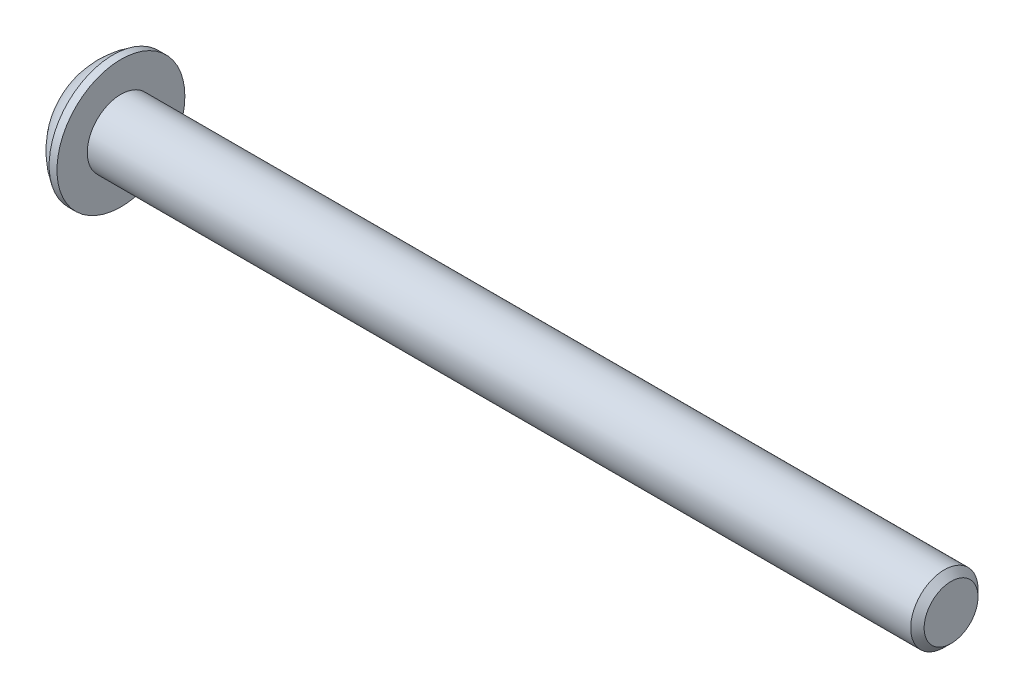
ISO-10303-21;
HEADER;
FILE_DESCRIPTION(('STEP AP214'),'2;1');
FILE_NAME('part.step','',(''),(''),'','','');
FILE_SCHEMA(('AUTOMOTIVE_DESIGN { 1 0 10303 214 1 1 1 1 }'));
ENDSEC;
DATA;
#1=APPLICATION_CONTEXT('core data for automotive mechanical design processes');
#2=APPLICATION_PROTOCOL_DEFINITION('international standard','automotive_design',2000,#1);
#3=PRODUCT_CONTEXT('',#1,'mechanical');
#4=PRODUCT('Part','Part','',(#3));
#5=PRODUCT_RELATED_PRODUCT_CATEGORY('part','',(#4));
#6=PRODUCT_DEFINITION_FORMATION('','',#4);
#7=PRODUCT_DEFINITION_CONTEXT('part definition',#1,'design');
#8=PRODUCT_DEFINITION('design','',#6,#7);
#9=PRODUCT_DEFINITION_SHAPE('','',#8);
#10=(LENGTH_UNIT() NAMED_UNIT(*) SI_UNIT(.MILLI.,.METRE.));
#11=(NAMED_UNIT(*) PLANE_ANGLE_UNIT() SI_UNIT($,.RADIAN.));
#12=(NAMED_UNIT(*) SI_UNIT($,.STERADIAN.) SOLID_ANGLE_UNIT());
#13=UNCERTAINTY_MEASURE_WITH_UNIT(LENGTH_MEASURE(1.E-05),#10,'distance_accuracy_value','');
#14=(GEOMETRIC_REPRESENTATION_CONTEXT(3) GLOBAL_UNCERTAINTY_ASSIGNED_CONTEXT((#13)) GLOBAL_UNIT_ASSIGNED_CONTEXT((#10,
#11,#12)) REPRESENTATION_CONTEXT('',''));
#15=CARTESIAN_POINT('',(0.,0.,0.));
#16=DIRECTION('',(0.,0.,1.));
#17=DIRECTION('',(1.,0.,0.));
#18=AXIS2_PLACEMENT_3D('',#15,#16,#17);
#19=CARTESIAN_POINT('',(-18.5,2.85,0.));
#20=DIRECTION('',(1.,0.,0.));
#21=DIRECTION('',(0.,0.,-1.));
#22=AXIS2_PLACEMENT_3D('',#19,#20,#21);
#23=PLANE('',#22);
#24=CARTESIAN_POINT('',(-18.5,0.,0.));
#25=DIRECTION('',(1.,0.,0.));
#26=DIRECTION('',(0.,0.,-1.));
#27=AXIS2_PLACEMENT_3D('',#24,#25,#26);
#28=CIRCLE('',#27,2.85);
#29=CARTESIAN_POINT('',(-18.5,0.,-2.85));
#30=VERTEX_POINT('',#29);
#31=EDGE_CURVE('E161',#30,#30,#28,.T.);
#32=ORIENTED_EDGE('',*,*,#31,.T.);
#33=EDGE_LOOP('',(#32));
#34=FACE_BOUND('',#33,.T.);
#35=CARTESIAN_POINT('',(-18.5,0.,0.));
#36=DIRECTION('',(1.,0.,0.));
#37=DIRECTION('',(0.,0.,-1.));
#38=AXIS2_PLACEMENT_3D('',#35,#36,#37);
#39=CIRCLE('',#38,1.5);
#40=CARTESIAN_POINT('',(-18.5,0.,-1.5));
#41=VERTEX_POINT('',#40);
#42=EDGE_CURVE('E182',#41,#41,#39,.T.);
#43=ORIENTED_EDGE('',*,*,#42,.F.);
#44=EDGE_LOOP('',(#43));
#45=FACE_BOUND('',#44,.T.);
#46=ADVANCED_FACE('F45',(#34,#45),#23,.T.);
#47=CARTESIAN_POINT('',(18.5,0.,0.));
#48=DIRECTION('',(1.,0.,0.));
#49=DIRECTION('',(0.,0.,-1.));
#50=AXIS2_PLACEMENT_3D('',#47,#48,#49);
#51=CYLINDRICAL_SURFACE('',#50,1.5);
#52=CARTESIAN_POINT('',(18.2,0.,0.));
#53=DIRECTION('',(1.,0.,0.));
#54=DIRECTION('',(0.,0.,-1.));
#55=AXIS2_PLACEMENT_3D('',#52,#53,#54);
#56=CIRCLE('',#55,1.5);
#57=CARTESIAN_POINT('',(18.2,0.,-1.5));
#58=VERTEX_POINT('',#57);
#59=EDGE_CURVE('E11',#58,#58,#56,.F.);
#60=ORIENTED_EDGE('',*,*,#59,.T.);
#61=EDGE_LOOP('',(#60));
#62=FACE_BOUND('',#61,.T.);
#63=ORIENTED_EDGE('',*,*,#42,.T.);
#64=EDGE_LOOP('',(#63));
#65=FACE_BOUND('',#64,.T.);
#66=ADVANCED_FACE('F206',(#62,#65),#51,.T.);
#67=CARTESIAN_POINT('',(18.5,0.,0.));
#68=DIRECTION('',(1.,0.,0.));
#69=DIRECTION('',(0.,0.,-1.));
#70=AXIS2_PLACEMENT_3D('',#67,#68,#69);
#71=PLANE('',#70);
#72=CARTESIAN_POINT('',(18.5,0.,0.));
#73=DIRECTION('',(1.,0.,0.));
#74=DIRECTION('',(0.,0.,-1.));
#75=AXIS2_PLACEMENT_3D('',#72,#73,#74);
#76=CIRCLE('',#75,1.2);
#77=CARTESIAN_POINT('',(18.5,0.,-1.2));
#78=VERTEX_POINT('',#77);
#79=EDGE_CURVE('E55',#78,#78,#76,.T.);
#80=ORIENTED_EDGE('',*,*,#79,.T.);
#81=EDGE_LOOP('',(#80));
#82=FACE_BOUND('',#81,.T.);
#83=ADVANCED_FACE('F189',(#82),#71,.T.);
#84=CARTESIAN_POINT('',(-20.15,0.,0.));
#85=DIRECTION('',(-1.,0.,0.));
#86=DIRECTION('',(0.,0.,1.));
#87=AXIS2_PLACEMENT_3D('',#84,#85,#86);
#88=PLANE('',#87);
#89=DIRECTION('',(0.,-0.5,-0.866025403784438));
#90=VECTOR('',#89,1.);
#91=CARTESIAN_POINT('',(-20.15,1.15470053837925,0.));
#92=LINE('',#91,#90);
#93=CARTESIAN_POINT('',(-20.15,1.15470053837925,0.));
#94=VERTEX_POINT('',#93);
#95=CARTESIAN_POINT('',(-20.15,0.577350269189626,-1.));
#96=VERTEX_POINT('',#95);
#97=EDGE_CURVE('E62',#94,#96,#92,.T.);
#98=ORIENTED_EDGE('',*,*,#97,.F.);
#99=DIRECTION('',(0.,0.5,-0.866025403784439));
#100=VECTOR('',#99,1.);
#101=CARTESIAN_POINT('',(-20.15,0.577350269189627,1.));
#102=LINE('',#101,#100);
#103=CARTESIAN_POINT('',(-20.15,0.577350269189627,1.));
#104=VERTEX_POINT('',#103);
#105=EDGE_CURVE('E155',#104,#94,#102,.T.);
#106=ORIENTED_EDGE('',*,*,#105,.F.);
#107=DIRECTION('',(0.,1.,0.));
#108=VECTOR('',#107,1.);
#109=CARTESIAN_POINT('',(-20.15,-0.577350269189625,1.));
#110=LINE('',#109,#108);
#111=CARTESIAN_POINT('',(-20.15,-0.577350269189625,1.));
#112=VERTEX_POINT('',#111);
#113=EDGE_CURVE('E152',#112,#104,#110,.T.);
#114=ORIENTED_EDGE('',*,*,#113,.F.);
#115=DIRECTION('',(0.,0.5,0.866025403784438));
#116=VECTOR('',#115,1.);
#117=CARTESIAN_POINT('',(-20.15,-1.15470053837925,0.));
#118=LINE('',#117,#116);
#119=CARTESIAN_POINT('',(-20.15,-1.15470053837925,0.));
#120=VERTEX_POINT('',#119);
#121=EDGE_CURVE('E110',#120,#112,#118,.T.);
#122=ORIENTED_EDGE('',*,*,#121,.F.);
#123=DIRECTION('',(0.,-0.5,0.866025403784439));
#124=VECTOR('',#123,1.);
#125=CARTESIAN_POINT('',(-20.15,-0.577350269189626,-1.));
#126=LINE('',#125,#124);
#127=CARTESIAN_POINT('',(-20.15,-0.577350269189626,-1.));
#128=VERTEX_POINT('',#127);
#129=EDGE_CURVE('E146',#128,#120,#126,.T.);
#130=ORIENTED_EDGE('',*,*,#129,.F.);
#131=DIRECTION('',(0.,-1.,0.));
#132=VECTOR('',#131,1.);
#133=CARTESIAN_POINT('',(-20.15,0.577350269189626,-1.));
#134=LINE('',#133,#132);
#135=EDGE_CURVE('E142',#96,#128,#134,.T.);
#136=ORIENTED_EDGE('',*,*,#135,.F.);
#137=EDGE_LOOP('',(#98,#106,#114,#122,#130,#136));
#138=FACE_BOUND('',#137,.T.);
#139=CARTESIAN_POINT('',(-20.15,0.,0.));
#140=DIRECTION('',(1.,0.,0.));
#141=DIRECTION('',(0.,0.,-1.));
#142=AXIS2_PLACEMENT_3D('',#139,#140,#141);
#143=CIRCLE('',#142,1.43);
#144=CARTESIAN_POINT('',(-20.15,0.,-1.43));
#145=VERTEX_POINT('',#144);
#146=EDGE_CURVE('E178',#145,#145,#143,.T.);
#147=ORIENTED_EDGE('',*,*,#146,.F.);
#148=EDGE_LOOP('',(#147));
#149=FACE_BOUND('',#148,.T.);
#150=ADVANCED_FACE('F217',(#138,#149),#88,.T.);
#151=CARTESIAN_POINT('',(-17.1332937444854,0.,0.));
#152=DIRECTION('',(1.,0.,0.));
#153=DIRECTION('',(0.,0.,-1.));
#154=AXIS2_PLACEMENT_3D('',#151,#152,#153);
#155=DEGENERATE_TOROIDAL_SURFACE('',#154,0.0267029099781809,3.35,.F.);
#156=ORIENTED_EDGE('',*,*,#146,.T.);
#157=EDGE_LOOP('',(#156));
#158=FACE_BOUND('',#157,.T.);
#159=CARTESIAN_POINT('',(-18.85,0.,0.));
#160=DIRECTION('',(1.,0.,0.));
#161=DIRECTION('',(0.,0.,-1.));
#162=AXIS2_PLACEMENT_3D('',#159,#160,#161);
#163=CIRCLE('',#162,2.85);
#164=CARTESIAN_POINT('',(-18.85,0.,-2.85));
#165=VERTEX_POINT('',#164);
#166=EDGE_CURVE('E174',#165,#165,#163,.T.);
#167=ORIENTED_EDGE('',*,*,#166,.F.);
#168=EDGE_LOOP('',(#167));
#169=FACE_BOUND('',#168,.T.);
#170=ADVANCED_FACE('F201',(#158,#169),#155,.F.);
#171=CARTESIAN_POINT('',(18.5,0.,0.));
#172=DIRECTION('',(1.,0.,0.));
#173=DIRECTION('',(0.,0.,-1.));
#174=AXIS2_PLACEMENT_3D('',#171,#172,#173);
#175=CYLINDRICAL_SURFACE('',#174,2.85);
#176=ORIENTED_EDGE('',*,*,#166,.T.);
#177=EDGE_LOOP('',(#176));
#178=FACE_BOUND('',#177,.T.);
#179=ORIENTED_EDGE('',*,*,#31,.F.);
#180=EDGE_LOOP('',(#179));
#181=FACE_BOUND('',#180,.T.);
#182=ADVANCED_FACE('F193',(#178,#181),#175,.T.);
#183=CARTESIAN_POINT('',(18.5,0.,0.));
#184=DIRECTION('',(-1.,0.,0.));
#185=DIRECTION('',(0.,0.,1.));
#186=AXIS2_PLACEMENT_3D('',#183,#184,#185);
#187=CONICAL_SURFACE('',#186,1.2,0.785398163397446);
#188=ORIENTED_EDGE('',*,*,#59,.F.);
#189=EDGE_LOOP('',(#188));
#190=FACE_BOUND('',#189,.T.);
#191=ORIENTED_EDGE('',*,*,#79,.F.);
#192=EDGE_LOOP('',(#191));
#193=FACE_BOUND('',#192,.T.);
#194=ADVANCED_FACE('F48',(#190,#193),#187,.T.);
#195=CARTESIAN_POINT('',(-19.15,1.15470053837925,0.));
#196=DIRECTION('',(0.,0.866025403784438,-0.5));
#197=DIRECTION('',(0.,0.5,0.866025403784439));
#198=AXIS2_PLACEMENT_3D('',#195,#196,#197);
#199=PLANE('',#198);
#200=ORIENTED_EDGE('',*,*,#97,.T.);
#201=DIRECTION('',(-1.,0.,0.));
#202=VECTOR('',#201,1.);
#203=CARTESIAN_POINT('',(-19.15,0.577350269189626,-1.));
#204=LINE('',#203,#202);
#205=CARTESIAN_POINT('',(-19.15,0.577350269189626,-1.));
#206=VERTEX_POINT('',#205);
#207=EDGE_CURVE('E92',#206,#96,#204,.T.);
#208=ORIENTED_EDGE('',*,*,#207,.F.);
#209=DIRECTION('',(0.,-0.5,-0.866025403784438));
#210=VECTOR('',#209,1.);
#211=CARTESIAN_POINT('',(-19.15,1.15470053837925,0.));
#212=LINE('',#211,#210);
#213=CARTESIAN_POINT('',(-19.15,1.15470053837925,0.));
#214=VERTEX_POINT('',#213);
#215=EDGE_CURVE('E158',#214,#206,#212,.T.);
#216=ORIENTED_EDGE('',*,*,#215,.F.);
#217=DIRECTION('',(-1.,0.,0.));
#218=VECTOR('',#217,1.);
#219=CARTESIAN_POINT('',(-19.15,1.15470053837925,0.));
#220=LINE('',#219,#218);
#221=EDGE_CURVE('E70',#214,#94,#220,.T.);
#222=ORIENTED_EDGE('',*,*,#221,.T.);
#223=EDGE_LOOP('',(#200,#208,#216,#222));
#224=FACE_BOUND('',#223,.T.);
#225=ADVANCED_FACE('F192',(#224),#199,.F.);
#226=CARTESIAN_POINT('',(-19.15,0.577350269189627,1.));
#227=DIRECTION('',(0.,0.866025403784439,0.5));
#228=DIRECTION('',(0.,-0.5,0.866025403784439));
#229=AXIS2_PLACEMENT_3D('',#226,#227,#228);
#230=PLANE('',#229);
#231=ORIENTED_EDGE('',*,*,#105,.T.);
#232=ORIENTED_EDGE('',*,*,#221,.F.);
#233=DIRECTION('',(0.,0.5,-0.866025403784439));
#234=VECTOR('',#233,1.);
#235=CARTESIAN_POINT('',(-19.15,0.577350269189627,1.));
#236=LINE('',#235,#234);
#237=CARTESIAN_POINT('',(-19.15,0.577350269189627,1.));
#238=VERTEX_POINT('',#237);
#239=EDGE_CURVE('E124',#238,#214,#236,.T.);
#240=ORIENTED_EDGE('',*,*,#239,.F.);
#241=DIRECTION('',(-1.,0.,0.));
#242=VECTOR('',#241,1.);
#243=CARTESIAN_POINT('',(-19.15,0.577350269189627,1.));
#244=LINE('',#243,#242);
#245=EDGE_CURVE('E115',#238,#104,#244,.T.);
#246=ORIENTED_EDGE('',*,*,#245,.T.);
#247=EDGE_LOOP('',(#231,#232,#240,#246));
#248=FACE_BOUND('',#247,.T.);
#249=ADVANCED_FACE('F199',(#248),#230,.F.);
#250=CARTESIAN_POINT('',(-19.15,-0.577350269189625,1.));
#251=DIRECTION('',(0.,0.,1.));
#252=DIRECTION('',(0.,-1.,0.));
#253=AXIS2_PLACEMENT_3D('',#250,#251,#252);
#254=PLANE('',#253);
#255=ORIENTED_EDGE('',*,*,#113,.T.);
#256=ORIENTED_EDGE('',*,*,#245,.F.);
#257=DIRECTION('',(0.,1.,0.));
#258=VECTOR('',#257,1.);
#259=CARTESIAN_POINT('',(-19.15,-0.577350269189625,1.));
#260=LINE('',#259,#258);
#261=CARTESIAN_POINT('',(-19.15,-0.577350269189625,1.));
#262=VERTEX_POINT('',#261);
#263=EDGE_CURVE('E119',#262,#238,#260,.T.);
#264=ORIENTED_EDGE('',*,*,#263,.F.);
#265=DIRECTION('',(-1.,0.,0.));
#266=VECTOR('',#265,1.);
#267=CARTESIAN_POINT('',(-19.15,-0.577350269189625,1.));
#268=LINE('',#267,#266);
#269=EDGE_CURVE('E103',#262,#112,#268,.T.);
#270=ORIENTED_EDGE('',*,*,#269,.T.);
#271=EDGE_LOOP('',(#255,#256,#264,#270));
#272=FACE_BOUND('',#271,.T.);
#273=ADVANCED_FACE('F120',(#272),#254,.F.);
#274=CARTESIAN_POINT('',(-19.15,-1.15470053837925,0.));
#275=DIRECTION('',(0.,-0.866025403784438,0.5));
#276=DIRECTION('',(0.,-0.5,-0.866025403784438));
#277=AXIS2_PLACEMENT_3D('',#274,#275,#276);
#278=PLANE('',#277);
#279=ORIENTED_EDGE('',*,*,#121,.T.);
#280=ORIENTED_EDGE('',*,*,#269,.F.);
#281=DIRECTION('',(0.,0.5,0.866025403784438));
#282=VECTOR('',#281,1.);
#283=CARTESIAN_POINT('',(-19.15,-1.15470053837925,0.));
#284=LINE('',#283,#282);
#285=CARTESIAN_POINT('',(-19.15,-1.15470053837925,0.));
#286=VERTEX_POINT('',#285);
#287=EDGE_CURVE('E107',#286,#262,#284,.T.);
#288=ORIENTED_EDGE('',*,*,#287,.F.);
#289=DIRECTION('',(-1.,0.,0.));
#290=VECTOR('',#289,1.);
#291=CARTESIAN_POINT('',(-19.15,-1.15470053837925,0.));
#292=LINE('',#291,#290);
#293=EDGE_CURVE('E116',#286,#120,#292,.T.);
#294=ORIENTED_EDGE('',*,*,#293,.T.);
#295=EDGE_LOOP('',(#279,#280,#288,#294));
#296=FACE_BOUND('',#295,.T.);
#297=ADVANCED_FACE('F105',(#296),#278,.F.);
#298=CARTESIAN_POINT('',(-19.15,-0.577350269189626,-1.));
#299=DIRECTION('',(0.,-0.866025403784439,-0.5));
#300=DIRECTION('',(0.,0.5,-0.866025403784439));
#301=AXIS2_PLACEMENT_3D('',#298,#299,#300);
#302=PLANE('',#301);
#303=ORIENTED_EDGE('',*,*,#129,.T.);
#304=ORIENTED_EDGE('',*,*,#293,.F.);
#305=DIRECTION('',(0.,-0.5,0.866025403784439));
#306=VECTOR('',#305,1.);
#307=CARTESIAN_POINT('',(-19.15,-0.577350269189626,-1.));
#308=LINE('',#307,#306);
#309=CARTESIAN_POINT('',(-19.15,-0.577350269189626,-1.));
#310=VERTEX_POINT('',#309);
#311=EDGE_CURVE('E130',#310,#286,#308,.T.);
#312=ORIENTED_EDGE('',*,*,#311,.F.);
#313=DIRECTION('',(-1.,0.,0.));
#314=VECTOR('',#313,1.);
#315=CARTESIAN_POINT('',(-19.15,-0.577350269189626,-1.));
#316=LINE('',#315,#314);
#317=EDGE_CURVE('E166',#310,#128,#316,.T.);
#318=ORIENTED_EDGE('',*,*,#317,.T.);
#319=EDGE_LOOP('',(#303,#304,#312,#318));
#320=FACE_BOUND('',#319,.T.);
#321=ADVANCED_FACE('F227',(#320),#302,.F.);
#322=CARTESIAN_POINT('',(-19.15,0.577350269189626,-1.));
#323=DIRECTION('',(0.,0.,-1.));
#324=DIRECTION('',(0.,1.,0.));
#325=AXIS2_PLACEMENT_3D('',#322,#323,#324);
#326=PLANE('',#325);
#327=ORIENTED_EDGE('',*,*,#135,.T.);
#328=ORIENTED_EDGE('',*,*,#317,.F.);
#329=DIRECTION('',(0.,-1.,0.));
#330=VECTOR('',#329,1.);
#331=CARTESIAN_POINT('',(-19.15,0.577350269189626,-1.));
#332=LINE('',#331,#330);
#333=EDGE_CURVE('E134',#206,#310,#332,.T.);
#334=ORIENTED_EDGE('',*,*,#333,.F.);
#335=ORIENTED_EDGE('',*,*,#207,.T.);
#336=EDGE_LOOP('',(#327,#328,#334,#335));
#337=FACE_BOUND('',#336,.T.);
#338=ADVANCED_FACE('F224',(#337),#326,.F.);
#339=CARTESIAN_POINT('',(-19.15,0.,0.));
#340=DIRECTION('',(-1.,0.,0.));
#341=DIRECTION('',(0.,0.,1.));
#342=AXIS2_PLACEMENT_3D('',#339,#340,#341);
#343=PLANE('',#342);
#344=ORIENTED_EDGE('',*,*,#215,.T.);
#345=ORIENTED_EDGE('',*,*,#333,.T.);
#346=ORIENTED_EDGE('',*,*,#311,.T.);
#347=ORIENTED_EDGE('',*,*,#287,.T.);
#348=ORIENTED_EDGE('',*,*,#263,.T.);
#349=ORIENTED_EDGE('',*,*,#239,.T.);
#350=EDGE_LOOP('',(#344,#345,#346,#347,#348,#349));
#351=FACE_BOUND('',#350,.T.);
#352=ADVANCED_FACE('F127',(#351),#343,.T.);
#353=CLOSED_SHELL('',(#46,#66,#83,#150,#170,#182,#194,#225,#249,#273,#297,#321,#338,#352));
#354=MANIFOLD_SOLID_BREP('B2',#353);
#355=ADVANCED_BREP_SHAPE_REPRESENTATION('',(#18,#354),#14);
#356=SHAPE_DEFINITION_REPRESENTATION(#9,#355);
ENDSEC;
END-ISO-10303-21;
